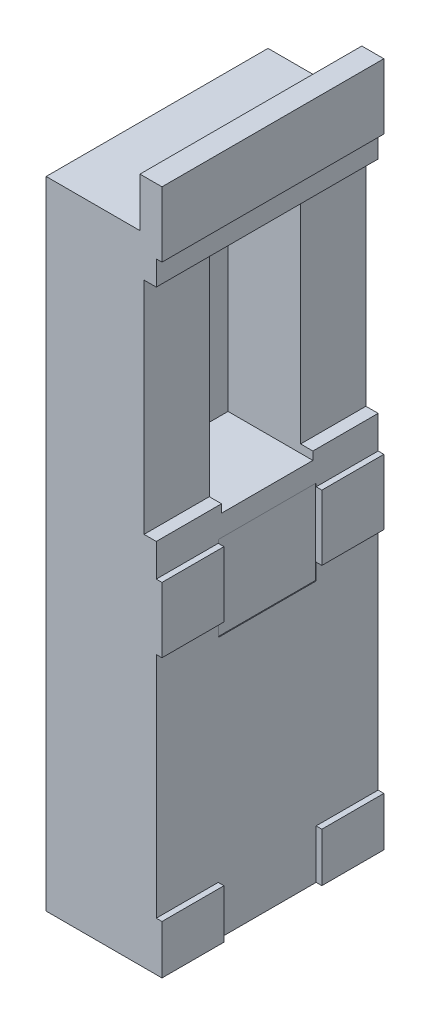
ISO-10303-21;
HEADER;
FILE_DESCRIPTION(('STEP AP214'),'2;1');
FILE_NAME('part.step','',(''),(''),'','','');
FILE_SCHEMA(('AUTOMOTIVE_DESIGN { 1 0 10303 214 1 1 1 1 }'));
ENDSEC;
DATA;
#1=APPLICATION_CONTEXT('core data for automotive mechanical design processes');
#2=APPLICATION_PROTOCOL_DEFINITION('international standard','automotive_design',2000,#1);
#3=PRODUCT_CONTEXT('',#1,'mechanical');
#4=PRODUCT('Part','Part','',(#3));
#5=PRODUCT_RELATED_PRODUCT_CATEGORY('part','',(#4));
#6=PRODUCT_DEFINITION_FORMATION('','',#4);
#7=PRODUCT_DEFINITION_CONTEXT('part definition',#1,'design');
#8=PRODUCT_DEFINITION('design','',#6,#7);
#9=PRODUCT_DEFINITION_SHAPE('','',#8);
#10=(LENGTH_UNIT() NAMED_UNIT(*) SI_UNIT(.MILLI.,.METRE.));
#11=(NAMED_UNIT(*) PLANE_ANGLE_UNIT() SI_UNIT($,.RADIAN.));
#12=(NAMED_UNIT(*) SI_UNIT($,.STERADIAN.) SOLID_ANGLE_UNIT());
#13=UNCERTAINTY_MEASURE_WITH_UNIT(LENGTH_MEASURE(1.E-05),#10,'distance_accuracy_value','');
#14=(GEOMETRIC_REPRESENTATION_CONTEXT(3) GLOBAL_UNCERTAINTY_ASSIGNED_CONTEXT((#13)) GLOBAL_UNIT_ASSIGNED_CONTEXT((#10,
#11,#12)) REPRESENTATION_CONTEXT('',''));
#15=CARTESIAN_POINT('',(0.,0.,0.));
#16=DIRECTION('',(0.,0.,1.));
#17=DIRECTION('',(1.,0.,0.));
#18=AXIS2_PLACEMENT_3D('',#15,#16,#17);
#19=CARTESIAN_POINT('',(-10.2,32.,13.6));
#20=DIRECTION('',(-1.,0.,0.));
#21=DIRECTION('',(0.,0.,1.));
#22=AXIS2_PLACEMENT_3D('',#19,#20,#21);
#23=PLANE('',#22);
#24=DIRECTION('',(0.,-1.,0.));
#25=VECTOR('',#24,1.);
#26=CARTESIAN_POINT('',(-10.2,32.,9.8));
#27=LINE('',#26,#25);
#28=CARTESIAN_POINT('',(-10.2,18.,9.8));
#29=VERTEX_POINT('',#28);
#30=CARTESIAN_POINT('',(-10.2,15.,9.8));
#31=VERTEX_POINT('',#30);
#32=EDGE_CURVE('E46',#29,#31,#27,.T.);
#33=ORIENTED_EDGE('',*,*,#32,.T.);
#34=DIRECTION('',(0.,0.,-1.));
#35=VECTOR('',#34,1.);
#36=CARTESIAN_POINT('',(-10.2,15.,13.6));
#37=LINE('',#36,#35);
#38=CARTESIAN_POINT('',(-10.2,15.,3.8));
#39=VERTEX_POINT('',#38);
#40=EDGE_CURVE('E394',#31,#39,#37,.T.);
#41=ORIENTED_EDGE('',*,*,#40,.T.);
#42=DIRECTION('',(0.,-1.,0.));
#43=VECTOR('',#42,1.);
#44=CARTESIAN_POINT('',(-10.2,32.,3.8));
#45=LINE('',#44,#43);
#46=CARTESIAN_POINT('',(-10.2,18.,3.8));
#47=VERTEX_POINT('',#46);
#48=EDGE_CURVE('E387',#47,#39,#45,.T.);
#49=ORIENTED_EDGE('',*,*,#48,.F.);
#50=DIRECTION('',(0.,0.,1.));
#51=VECTOR('',#50,1.);
#52=CARTESIAN_POINT('',(-10.2,18.,13.6));
#53=LINE('',#52,#51);
#54=CARTESIAN_POINT('',(-10.2,18.,0.));
#55=VERTEX_POINT('',#54);
#56=EDGE_CURVE('E424',#55,#47,#53,.T.);
#57=ORIENTED_EDGE('',*,*,#56,.F.);
#58=DIRECTION('',(0.,1.,0.));
#59=VECTOR('',#58,1.);
#60=CARTESIAN_POINT('',(-10.2,32.,0.));
#61=LINE('',#60,#59);
#62=CARTESIAN_POINT('',(-10.2,32.,0.));
#63=VERTEX_POINT('',#62);
#64=EDGE_CURVE('E307',#55,#63,#61,.T.);
#65=ORIENTED_EDGE('',*,*,#64,.T.);
#66=DIRECTION('',(0.,0.,-1.));
#67=VECTOR('',#66,1.);
#68=CARTESIAN_POINT('',(-10.2,32.,13.6));
#69=LINE('',#68,#67);
#70=CARTESIAN_POINT('',(-10.2,32.,3.8));
#71=VERTEX_POINT('',#70);
#72=EDGE_CURVE('E369',#71,#63,#69,.T.);
#73=ORIENTED_EDGE('',*,*,#72,.F.);
#74=DIRECTION('',(0.,-1.,0.));
#75=VECTOR('',#74,1.);
#76=CARTESIAN_POINT('',(-10.2,32.,3.8));
#77=LINE('',#76,#75);
#78=CARTESIAN_POINT('',(-10.2,31.,3.8));
#79=VERTEX_POINT('',#78);
#80=EDGE_CURVE('E463',#71,#79,#77,.T.);
#81=ORIENTED_EDGE('',*,*,#80,.T.);
#82=DIRECTION('',(0.,0.,1.));
#83=VECTOR('',#82,1.);
#84=CARTESIAN_POINT('',(-10.2,31.,13.6));
#85=LINE('',#84,#83);
#86=CARTESIAN_POINT('',(-10.2,31.,9.8));
#87=VERTEX_POINT('',#86);
#88=EDGE_CURVE('E384',#79,#87,#85,.T.);
#89=ORIENTED_EDGE('',*,*,#88,.T.);
#90=DIRECTION('',(0.,-1.,0.));
#91=VECTOR('',#90,1.);
#92=CARTESIAN_POINT('',(-10.2,32.,9.8));
#93=LINE('',#92,#91);
#94=CARTESIAN_POINT('',(-10.2,32.,9.8));
#95=VERTEX_POINT('',#94);
#96=EDGE_CURVE('E456',#95,#87,#93,.T.);
#97=ORIENTED_EDGE('',*,*,#96,.F.);
#98=CARTESIAN_POINT('',(-10.2,32.,13.6));
#99=VERTEX_POINT('',#98);
#100=EDGE_CURVE('E370',#99,#95,#69,.T.);
#101=ORIENTED_EDGE('',*,*,#100,.F.);
#102=DIRECTION('',(0.,1.,0.));
#103=VECTOR('',#102,1.);
#104=CARTESIAN_POINT('',(-10.2,32.,13.6));
#105=LINE('',#104,#103);
#106=CARTESIAN_POINT('',(-10.2,18.,13.6));
#107=VERTEX_POINT('',#106);
#108=EDGE_CURVE('E341',#107,#99,#105,.T.);
#109=ORIENTED_EDGE('',*,*,#108,.F.);
#110=DIRECTION('',(0.,0.,1.));
#111=VECTOR('',#110,1.);
#112=CARTESIAN_POINT('',(-10.2,18.,13.6));
#113=LINE('',#112,#111);
#114=EDGE_CURVE('E397',#29,#107,#113,.T.);
#115=ORIENTED_EDGE('',*,*,#114,.F.);
#116=EDGE_LOOP('',(#33,#41,#49,#57,#65,#73,#81,#89,#97,#101,#109,#115));
#117=FACE_BOUND('',#116,.T.);
#118=ADVANCED_FACE('F39',(#117),#23,.F.);
#119=CARTESIAN_POINT('',(-4.7,32.,13.6));
#120=DIRECTION('',(0.,1.,0.));
#121=DIRECTION('',(0.,0.,1.));
#122=AXIS2_PLACEMENT_3D('',#119,#120,#121);
#123=PLANE('',#122);
#124=DIRECTION('',(-1.,0.,0.));
#125=VECTOR('',#124,1.);
#126=CARTESIAN_POINT('',(-4.7,32.,9.8));
#127=LINE('',#126,#125);
#128=CARTESIAN_POINT('',(-9.85,32.,9.8));
#129=VERTEX_POINT('',#128);
#130=EDGE_CURVE('E454',#129,#95,#127,.T.);
#131=ORIENTED_EDGE('',*,*,#130,.F.);
#132=DIRECTION('',(0.,0.,1.));
#133=VECTOR('',#132,1.);
#134=CARTESIAN_POINT('',(-9.85,32.,13.6));
#135=LINE('',#134,#133);
#136=CARTESIAN_POINT('',(-9.85,32.,13.6));
#137=VERTEX_POINT('',#136);
#138=EDGE_CURVE('E590',#129,#137,#135,.T.);
#139=ORIENTED_EDGE('',*,*,#138,.T.);
#140=DIRECTION('',(1.,0.,0.));
#141=VECTOR('',#140,1.);
#142=CARTESIAN_POINT('',(-4.7,32.,13.6));
#143=LINE('',#142,#141);
#144=EDGE_CURVE('E502',#99,#137,#143,.T.);
#145=ORIENTED_EDGE('',*,*,#144,.F.);
#146=ORIENTED_EDGE('',*,*,#100,.T.);
#147=EDGE_LOOP('',(#131,#139,#145,#146));
#148=FACE_BOUND('',#147,.T.);
#149=ADVANCED_FACE('F588',(#148),#123,.F.);
#150=CARTESIAN_POINT('',(-10.2,36.,13.6));
#151=DIRECTION('',(0.,-1.,0.));
#152=DIRECTION('',(0.,0.,-1.));
#153=AXIS2_PLACEMENT_3D('',#150,#151,#152);
#154=PLANE('',#153);
#155=DIRECTION('',(-1.,0.,0.));
#156=VECTOR('',#155,1.);
#157=CARTESIAN_POINT('',(-10.2,36.,13.6));
#158=LINE('',#157,#156);
#159=CARTESIAN_POINT('',(-9.85,36.,13.6));
#160=VERTEX_POINT('',#159);
#161=CARTESIAN_POINT('',(-10.2,36.,13.6));
#162=VERTEX_POINT('',#161);
#163=EDGE_CURVE('E505',#160,#162,#158,.T.);
#164=ORIENTED_EDGE('',*,*,#163,.F.);
#165=DIRECTION('',(0.,0.,-1.));
#166=VECTOR('',#165,1.);
#167=CARTESIAN_POINT('',(-9.85,36.,13.6));
#168=LINE('',#167,#166);
#169=CARTESIAN_POINT('',(-9.85,36.,9.8));
#170=VERTEX_POINT('',#169);
#171=EDGE_CURVE('E603',#160,#170,#168,.T.);
#172=ORIENTED_EDGE('',*,*,#171,.T.);
#173=DIRECTION('',(1.,0.,0.));
#174=VECTOR('',#173,1.);
#175=CARTESIAN_POINT('',(-10.2,36.,9.8));
#176=LINE('',#175,#174);
#177=CARTESIAN_POINT('',(-10.2,36.,9.8));
#178=VERTEX_POINT('',#177);
#179=EDGE_CURVE('E449',#178,#170,#176,.T.);
#180=ORIENTED_EDGE('',*,*,#179,.F.);
#181=DIRECTION('',(0.,0.,-1.));
#182=VECTOR('',#181,1.);
#183=CARTESIAN_POINT('',(-10.2,36.,13.6));
#184=LINE('',#183,#182);
#185=EDGE_CURVE('E366',#162,#178,#184,.T.);
#186=ORIENTED_EDGE('',*,*,#185,.F.);
#187=EDGE_LOOP('',(#164,#172,#180,#186));
#188=FACE_BOUND('',#187,.T.);
#189=ADVANCED_FACE('F644',(#188),#154,.F.);
#190=CARTESIAN_POINT('',(-10.95,38.,13.6));
#191=DIRECTION('',(0.,-1.,0.));
#192=DIRECTION('',(0.,0.,-1.));
#193=AXIS2_PLACEMENT_3D('',#190,#191,#192);
#194=PLANE('',#193);
#195=DIRECTION('',(1.,0.,0.));
#196=VECTOR('',#195,1.);
#197=CARTESIAN_POINT('',(-10.95,38.,9.6));
#198=LINE('',#197,#196);
#199=CARTESIAN_POINT('',(-10.95,38.,9.6));
#200=VERTEX_POINT('',#199);
#201=CARTESIAN_POINT('',(-10.2,38.,9.6));
#202=VERTEX_POINT('',#201);
#203=EDGE_CURVE('E489',#200,#202,#198,.T.);
#204=ORIENTED_EDGE('',*,*,#203,.F.);
#205=DIRECTION('',(0.,0.,-1.));
#206=VECTOR('',#205,1.);
#207=CARTESIAN_POINT('',(-10.95,38.,13.6));
#208=LINE('',#207,#206);
#209=CARTESIAN_POINT('',(-10.95,38.,13.6));
#210=VERTEX_POINT('',#209);
#211=EDGE_CURVE('E358',#210,#200,#208,.T.);
#212=ORIENTED_EDGE('',*,*,#211,.F.);
#213=DIRECTION('',(-1.,0.,0.));
#214=VECTOR('',#213,1.);
#215=CARTESIAN_POINT('',(-10.95,38.,13.6));
#216=LINE('',#215,#214);
#217=CARTESIAN_POINT('',(-10.2,38.,13.6));
#218=VERTEX_POINT('',#217);
#219=EDGE_CURVE('E509',#218,#210,#216,.T.);
#220=ORIENTED_EDGE('',*,*,#219,.F.);
#221=DIRECTION('',(0.,0.,-1.));
#222=VECTOR('',#221,1.);
#223=CARTESIAN_POINT('',(-10.2,38.,13.6));
#224=LINE('',#223,#222);
#225=EDGE_CURVE('E362',#218,#202,#224,.T.);
#226=ORIENTED_EDGE('',*,*,#225,.T.);
#227=EDGE_LOOP('',(#204,#212,#220,#226));
#228=FACE_BOUND('',#227,.T.);
#229=ADVANCED_FACE('F648',(#228),#194,.F.);
#230=CARTESIAN_POINT('',(-10.95,51.5,13.6));
#231=DIRECTION('',(-1.,0.,0.));
#232=DIRECTION('',(0.,0.,1.));
#233=AXIS2_PLACEMENT_3D('',#230,#231,#232);
#234=PLANE('',#233);
#235=DIRECTION('',(0.,-1.,0.));
#236=VECTOR('',#235,1.);
#237=CARTESIAN_POINT('',(-10.95,51.5,9.6));
#238=LINE('',#237,#236);
#239=CARTESIAN_POINT('',(-10.95,51.5,9.6));
#240=VERTEX_POINT('',#239);
#241=EDGE_CURVE('E485',#240,#200,#238,.T.);
#242=ORIENTED_EDGE('',*,*,#241,.F.);
#243=DIRECTION('',(0.,0.,-1.));
#244=VECTOR('',#243,1.);
#245=CARTESIAN_POINT('',(-10.95,51.5,13.6));
#246=LINE('',#245,#244);
#247=CARTESIAN_POINT('',(-10.95,51.5,13.6));
#248=VERTEX_POINT('',#247);
#249=EDGE_CURVE('E354',#248,#240,#246,.T.);
#250=ORIENTED_EDGE('',*,*,#249,.F.);
#251=DIRECTION('',(0.,1.,0.));
#252=VECTOR('',#251,1.);
#253=CARTESIAN_POINT('',(-10.95,51.5,13.6));
#254=LINE('',#253,#252);
#255=EDGE_CURVE('E511',#210,#248,#254,.T.);
#256=ORIENTED_EDGE('',*,*,#255,.F.);
#257=ORIENTED_EDGE('',*,*,#211,.T.);
#258=EDGE_LOOP('',(#242,#250,#256,#257));
#259=FACE_BOUND('',#258,.T.);
#260=ADVANCED_FACE('F652',(#259),#234,.F.);
#261=DIRECTION('',(1.,0.,0.));
#262=VECTOR('',#261,1.);
#263=CARTESIAN_POINT('',(-4.7,32.,0.));
#264=LINE('',#263,#262);
#265=CARTESIAN_POINT('',(-9.85,32.,0.));
#266=VERTEX_POINT('',#265);
#267=EDGE_CURVE('E309',#63,#266,#264,.T.);
#268=ORIENTED_EDGE('',*,*,#267,.T.);
#269=DIRECTION('',(0.,0.,1.));
#270=VECTOR('',#269,1.);
#271=CARTESIAN_POINT('',(-9.85,32.,13.6));
#272=LINE('',#271,#270);
#273=CARTESIAN_POINT('',(-9.85,32.,3.8));
#274=VERTEX_POINT('',#273);
#275=EDGE_CURVE('E571',#266,#274,#272,.T.);
#276=ORIENTED_EDGE('',*,*,#275,.T.);
#277=DIRECTION('',(-1.,0.,0.));
#278=VECTOR('',#277,1.);
#279=CARTESIAN_POINT('',(-4.7,32.,3.8));
#280=LINE('',#279,#278);
#281=EDGE_CURVE('E461',#274,#71,#280,.T.);
#282=ORIENTED_EDGE('',*,*,#281,.T.);
#283=ORIENTED_EDGE('',*,*,#72,.T.);
#284=EDGE_LOOP('',(#268,#276,#282,#283));
#285=FACE_BOUND('',#284,.T.);
#286=ADVANCED_FACE('F567',(#285),#123,.F.);
#287=DIRECTION('',(1.,0.,0.));
#288=VECTOR('',#287,1.);
#289=CARTESIAN_POINT('',(-10.2,36.,3.8));
#290=LINE('',#289,#288);
#291=CARTESIAN_POINT('',(-10.2,36.,3.8));
#292=VERTEX_POINT('',#291);
#293=CARTESIAN_POINT('',(-9.85,36.,3.8));
#294=VERTEX_POINT('',#293);
#295=EDGE_CURVE('E458',#292,#294,#290,.T.);
#296=ORIENTED_EDGE('',*,*,#295,.T.);
#297=DIRECTION('',(0.,0.,-1.));
#298=VECTOR('',#297,1.);
#299=CARTESIAN_POINT('',(-9.85,36.,13.6));
#300=LINE('',#299,#298);
#301=CARTESIAN_POINT('',(-9.85,36.,0.));
#302=VERTEX_POINT('',#301);
#303=EDGE_CURVE('E61',#294,#302,#300,.T.);
#304=ORIENTED_EDGE('',*,*,#303,.T.);
#305=DIRECTION('',(-1.,0.,0.));
#306=VECTOR('',#305,1.);
#307=CARTESIAN_POINT('',(-10.2,36.,0.));
#308=LINE('',#307,#306);
#309=CARTESIAN_POINT('',(-10.2,36.,0.));
#310=VERTEX_POINT('',#309);
#311=EDGE_CURVE('E313',#302,#310,#308,.T.);
#312=ORIENTED_EDGE('',*,*,#311,.T.);
#313=EDGE_CURVE('E365',#292,#310,#184,.T.);
#314=ORIENTED_EDGE('',*,*,#313,.F.);
#315=EDGE_LOOP('',(#296,#304,#312,#314));
#316=FACE_BOUND('',#315,.T.);
#317=ADVANCED_FACE('F612',(#316),#154,.F.);
#318=CARTESIAN_POINT('',(-10.2,38.,13.6));
#319=DIRECTION('',(-1.,0.,0.));
#320=DIRECTION('',(0.,0.,1.));
#321=AXIS2_PLACEMENT_3D('',#318,#319,#320);
#322=PLANE('',#321);
#323=DIRECTION('',(0.,0.,-1.));
#324=VECTOR('',#323,1.);
#325=CARTESIAN_POINT('',(-10.2,36.2,13.6));
#326=LINE('',#325,#324);
#327=CARTESIAN_POINT('',(-10.2,36.2,9.8));
#328=VERTEX_POINT('',#327);
#329=CARTESIAN_POINT('',(-10.2,36.2,3.8));
#330=VERTEX_POINT('',#329);
#331=EDGE_CURVE('E378',#328,#330,#326,.T.);
#332=ORIENTED_EDGE('',*,*,#331,.T.);
#333=DIRECTION('',(0.,-1.,0.));
#334=VECTOR('',#333,1.);
#335=CARTESIAN_POINT('',(-10.2,38.,3.8));
#336=LINE('',#335,#334);
#337=EDGE_CURVE('E381',#330,#292,#336,.T.);
#338=ORIENTED_EDGE('',*,*,#337,.T.);
#339=ORIENTED_EDGE('',*,*,#313,.T.);
#340=DIRECTION('',(0.,1.,0.));
#341=VECTOR('',#340,1.);
#342=CARTESIAN_POINT('',(-10.2,38.,0.));
#343=LINE('',#342,#341);
#344=CARTESIAN_POINT('',(-10.2,38.,0.));
#345=VERTEX_POINT('',#344);
#346=EDGE_CURVE('E315',#310,#345,#343,.T.);
#347=ORIENTED_EDGE('',*,*,#346,.T.);
#348=CARTESIAN_POINT('',(-10.2,38.,4.));
#349=VERTEX_POINT('',#348);
#350=EDGE_CURVE('E361',#349,#345,#224,.T.);
#351=ORIENTED_EDGE('',*,*,#350,.F.);
#352=DIRECTION('',(0.,-1.,0.));
#353=VECTOR('',#352,1.);
#354=CARTESIAN_POINT('',(-10.2,38.,4.));
#355=LINE('',#354,#353);
#356=CARTESIAN_POINT('',(-10.2,37.5,4.));
#357=VERTEX_POINT('',#356);
#358=EDGE_CURVE('E310',#349,#357,#355,.T.);
#359=ORIENTED_EDGE('',*,*,#358,.T.);
#360=DIRECTION('',(0.,0.,1.));
#361=VECTOR('',#360,1.);
#362=CARTESIAN_POINT('',(-10.2,37.5,13.6));
#363=LINE('',#362,#361);
#364=CARTESIAN_POINT('',(-10.2,37.5,9.6));
#365=VERTEX_POINT('',#364);
#366=EDGE_CURVE('E373',#357,#365,#363,.T.);
#367=ORIENTED_EDGE('',*,*,#366,.T.);
#368=DIRECTION('',(0.,-1.,0.));
#369=VECTOR('',#368,1.);
#370=CARTESIAN_POINT('',(-10.2,38.,9.6));
#371=LINE('',#370,#369);
#372=EDGE_CURVE('E491',#202,#365,#371,.T.);
#373=ORIENTED_EDGE('',*,*,#372,.F.);
#374=ORIENTED_EDGE('',*,*,#225,.F.);
#375=DIRECTION('',(0.,1.,0.));
#376=VECTOR('',#375,1.);
#377=CARTESIAN_POINT('',(-10.2,38.,13.6));
#378=LINE('',#377,#376);
#379=EDGE_CURVE('E507',#162,#218,#378,.T.);
#380=ORIENTED_EDGE('',*,*,#379,.F.);
#381=ORIENTED_EDGE('',*,*,#185,.T.);
#382=DIRECTION('',(0.,-1.,0.));
#383=VECTOR('',#382,1.);
#384=CARTESIAN_POINT('',(-10.2,38.,9.8));
#385=LINE('',#384,#383);
#386=EDGE_CURVE('E376',#328,#178,#385,.T.);
#387=ORIENTED_EDGE('',*,*,#386,.F.);
#388=EDGE_LOOP('',(#332,#338,#339,#347,#351,#359,#367,#373,#374,#380,#381,#387));
#389=FACE_BOUND('',#388,.T.);
#390=ADVANCED_FACE('F620',(#389),#322,.F.);
#391=CARTESIAN_POINT('',(-10.95,38.,4.));
#392=VERTEX_POINT('',#391);
#393=CARTESIAN_POINT('',(-10.95,38.,0.));
#394=VERTEX_POINT('',#393);
#395=EDGE_CURVE('E357',#392,#394,#208,.T.);
#396=ORIENTED_EDGE('',*,*,#395,.F.);
#397=DIRECTION('',(1.,0.,0.));
#398=VECTOR('',#397,1.);
#399=CARTESIAN_POINT('',(-10.95,38.,4.));
#400=LINE('',#399,#398);
#401=EDGE_CURVE('E496',#392,#349,#400,.T.);
#402=ORIENTED_EDGE('',*,*,#401,.T.);
#403=ORIENTED_EDGE('',*,*,#350,.T.);
#404=DIRECTION('',(-1.,0.,0.));
#405=VECTOR('',#404,1.);
#406=CARTESIAN_POINT('',(-10.95,38.,0.));
#407=LINE('',#406,#405);
#408=EDGE_CURVE('E318',#345,#394,#407,.T.);
#409=ORIENTED_EDGE('',*,*,#408,.T.);
#410=EDGE_LOOP('',(#396,#402,#403,#409));
#411=FACE_BOUND('',#410,.T.);
#412=ADVANCED_FACE('F665',(#411),#194,.F.);
#413=CARTESIAN_POINT('',(-10.95,51.5,4.));
#414=VERTEX_POINT('',#413);
#415=CARTESIAN_POINT('',(-10.95,51.5,0.));
#416=VERTEX_POINT('',#415);
#417=EDGE_CURVE('E353',#414,#416,#246,.T.);
#418=ORIENTED_EDGE('',*,*,#417,.F.);
#419=DIRECTION('',(0.,-1.,0.));
#420=VECTOR('',#419,1.);
#421=CARTESIAN_POINT('',(-10.95,51.5,4.));
#422=LINE('',#421,#420);
#423=EDGE_CURVE('E493',#414,#392,#422,.T.);
#424=ORIENTED_EDGE('',*,*,#423,.T.);
#425=ORIENTED_EDGE('',*,*,#395,.T.);
#426=DIRECTION('',(0.,1.,0.));
#427=VECTOR('',#426,1.);
#428=CARTESIAN_POINT('',(-10.95,51.5,0.));
#429=LINE('',#428,#427);
#430=EDGE_CURVE('E321',#394,#416,#429,.T.);
#431=ORIENTED_EDGE('',*,*,#430,.T.);
#432=EDGE_LOOP('',(#418,#424,#425,#431));
#433=FACE_BOUND('',#432,.T.);
#434=ADVANCED_FACE('F659',(#433),#234,.F.);
#435=CARTESIAN_POINT('',(-10.2,51.5,13.6));
#436=DIRECTION('',(0.,1.,0.));
#437=DIRECTION('',(0.,0.,1.));
#438=AXIS2_PLACEMENT_3D('',#435,#436,#437);
#439=PLANE('',#438);
#440=DIRECTION('',(1.,0.,0.));
#441=VECTOR('',#440,1.);
#442=CARTESIAN_POINT('',(-10.2,51.5,0.));
#443=LINE('',#442,#441);
#444=CARTESIAN_POINT('',(-10.2,51.5,0.));
#445=VERTEX_POINT('',#444);
#446=EDGE_CURVE('E324',#416,#445,#443,.T.);
#447=ORIENTED_EDGE('',*,*,#446,.T.);
#448=DIRECTION('',(0.,0.,-1.));
#449=VECTOR('',#448,1.);
#450=CARTESIAN_POINT('',(-10.2,51.5,13.6));
#451=LINE('',#450,#449);
#452=CARTESIAN_POINT('',(-10.2,51.5,13.6));
#453=VERTEX_POINT('',#452);
#454=EDGE_CURVE('E351',#453,#445,#451,.T.);
#455=ORIENTED_EDGE('',*,*,#454,.F.);
#456=DIRECTION('',(1.,0.,0.));
#457=VECTOR('',#456,1.);
#458=CARTESIAN_POINT('',(-10.2,51.5,13.6));
#459=LINE('',#458,#457);
#460=EDGE_CURVE('E513',#248,#453,#459,.T.);
#461=ORIENTED_EDGE('',*,*,#460,.F.);
#462=ORIENTED_EDGE('',*,*,#249,.T.);
#463=DIRECTION('',(-1.,0.,0.));
#464=VECTOR('',#463,1.);
#465=CARTESIAN_POINT('',(-15.4,51.5,9.6));
#466=LINE('',#465,#464);
#467=CARTESIAN_POINT('',(-15.4,51.5,9.6));
#468=VERTEX_POINT('',#467);
#469=EDGE_CURVE('E466',#240,#468,#466,.T.);
#470=ORIENTED_EDGE('',*,*,#469,.T.);
#471=DIRECTION('',(0.,0.,1.));
#472=VECTOR('',#471,1.);
#473=CARTESIAN_POINT('',(-15.4,51.5,4.));
#474=LINE('',#473,#472);
#475=CARTESIAN_POINT('',(-15.4,51.5,4.));
#476=VERTEX_POINT('',#475);
#477=EDGE_CURVE('E476',#476,#468,#474,.T.);
#478=ORIENTED_EDGE('',*,*,#477,.F.);
#479=DIRECTION('',(-1.,0.,0.));
#480=VECTOR('',#479,1.);
#481=CARTESIAN_POINT('',(-15.4,51.5,4.));
#482=LINE('',#481,#480);
#483=EDGE_CURVE('E467',#414,#476,#482,.T.);
#484=ORIENTED_EDGE('',*,*,#483,.F.);
#485=ORIENTED_EDGE('',*,*,#417,.T.);
#486=EDGE_LOOP('',(#447,#455,#461,#462,#470,#478,#484,#485));
#487=FACE_BOUND('',#486,.T.);
#488=ADVANCED_FACE('F669',(#487),#439,.F.);
#489=CARTESIAN_POINT('',(-10.2,53.,13.6));
#490=DIRECTION('',(-1.,0.,0.));
#491=DIRECTION('',(0.,0.,1.));
#492=AXIS2_PLACEMENT_3D('',#489,#490,#491);
#493=PLANE('',#492);
#494=DIRECTION('',(0.,1.,0.));
#495=VECTOR('',#494,1.);
#496=CARTESIAN_POINT('',(-10.2,53.,0.));
#497=LINE('',#496,#495);
#498=CARTESIAN_POINT('',(-10.2,53.,0.));
#499=VERTEX_POINT('',#498);
#500=EDGE_CURVE('E327',#445,#499,#497,.T.);
#501=ORIENTED_EDGE('',*,*,#500,.T.);
#502=DIRECTION('',(0.,0.,-1.));
#503=VECTOR('',#502,1.);
#504=CARTESIAN_POINT('',(-10.2,53.,13.6));
#505=LINE('',#504,#503);
#506=CARTESIAN_POINT('',(-10.2,53.,13.6));
#507=VERTEX_POINT('',#506);
#508=EDGE_CURVE('E348',#507,#499,#505,.T.);
#509=ORIENTED_EDGE('',*,*,#508,.F.);
#510=DIRECTION('',(0.,1.,0.));
#511=VECTOR('',#510,1.);
#512=CARTESIAN_POINT('',(-10.2,53.,13.6));
#513=LINE('',#512,#511);
#514=EDGE_CURVE('E298',#453,#507,#513,.T.);
#515=ORIENTED_EDGE('',*,*,#514,.F.);
#516=ORIENTED_EDGE('',*,*,#454,.T.);
#517=EDGE_LOOP('',(#501,#509,#515,#516));
#518=FACE_BOUND('',#517,.T.);
#519=ADVANCED_FACE('F519',(#518),#493,.F.);
#520=CARTESIAN_POINT('',(-4.7,53.,13.6));
#521=DIRECTION('',(0.,1.,0.));
#522=DIRECTION('',(0.,0.,1.));
#523=AXIS2_PLACEMENT_3D('',#520,#521,#522);
#524=PLANE('',#523);
#525=DIRECTION('',(1.,0.,0.));
#526=VECTOR('',#525,1.);
#527=CARTESIAN_POINT('',(-4.7,53.,0.));
#528=LINE('',#527,#526);
#529=CARTESIAN_POINT('',(-9.85,53.,0.));
#530=VERTEX_POINT('',#529);
#531=EDGE_CURVE('E329',#499,#530,#528,.T.);
#532=ORIENTED_EDGE('',*,*,#531,.T.);
#533=DIRECTION('',(0.,0.,1.));
#534=VECTOR('',#533,1.);
#535=CARTESIAN_POINT('',(-9.85,53.,13.6));
#536=LINE('',#535,#534);
#537=CARTESIAN_POINT('',(-9.85,53.,13.6));
#538=VERTEX_POINT('',#537);
#539=EDGE_CURVE('E53',#530,#538,#536,.T.);
#540=ORIENTED_EDGE('',*,*,#539,.T.);
#541=DIRECTION('',(1.,0.,0.));
#542=VECTOR('',#541,1.);
#543=CARTESIAN_POINT('',(-4.7,53.,13.6));
#544=LINE('',#543,#542);
#545=EDGE_CURVE('E285',#507,#538,#544,.T.);
#546=ORIENTED_EDGE('',*,*,#545,.F.);
#547=ORIENTED_EDGE('',*,*,#508,.T.);
#548=EDGE_LOOP('',(#532,#540,#546,#547));
#549=FACE_BOUND('',#548,.T.);
#550=ADVANCED_FACE('F523',(#549),#524,.F.);
#551=CARTESIAN_POINT('',(-11.2,57.,13.6));
#552=DIRECTION('',(0.,-1.,0.));
#553=DIRECTION('',(0.,0.,-1.));
#554=AXIS2_PLACEMENT_3D('',#551,#552,#553);
#555=PLANE('',#554);
#556=DIRECTION('',(-1.,0.,0.));
#557=VECTOR('',#556,1.);
#558=CARTESIAN_POINT('',(-11.2,57.,13.6));
#559=LINE('',#558,#557);
#560=CARTESIAN_POINT('',(-9.85,57.,13.6));
#561=VERTEX_POINT('',#560);
#562=CARTESIAN_POINT('',(-11.2,57.,13.6));
#563=VERTEX_POINT('',#562);
#564=EDGE_CURVE('E282',#561,#563,#559,.T.);
#565=ORIENTED_EDGE('',*,*,#564,.F.);
#566=DIRECTION('',(0.,0.,-1.));
#567=VECTOR('',#566,1.);
#568=CARTESIAN_POINT('',(-9.85,57.,13.6));
#569=LINE('',#568,#567);
#570=CARTESIAN_POINT('',(-9.85,57.,0.));
#571=VERTEX_POINT('',#570);
#572=EDGE_CURVE('E269',#561,#571,#569,.T.);
#573=ORIENTED_EDGE('',*,*,#572,.T.);
#574=DIRECTION('',(-1.,0.,0.));
#575=VECTOR('',#574,1.);
#576=CARTESIAN_POINT('',(-11.2,57.,0.));
#577=LINE('',#576,#575);
#578=CARTESIAN_POINT('',(-11.2,57.,0.));
#579=VERTEX_POINT('',#578);
#580=EDGE_CURVE('E332',#571,#579,#577,.T.);
#581=ORIENTED_EDGE('',*,*,#580,.T.);
#582=DIRECTION('',(0.,0.,-1.));
#583=VECTOR('',#582,1.);
#584=CARTESIAN_POINT('',(-11.2,57.,13.6));
#585=LINE('',#584,#583);
#586=EDGE_CURVE('E292',#563,#579,#585,.T.);
#587=ORIENTED_EDGE('',*,*,#586,.F.);
#588=EDGE_LOOP('',(#565,#573,#581,#587));
#589=FACE_BOUND('',#588,.T.);
#590=ADVANCED_FACE('F290',(#589),#555,.F.);
#591=CARTESIAN_POINT('',(-11.2,54.,13.6));
#592=DIRECTION('',(1.,0.,0.));
#593=DIRECTION('',(0.,0.,-1.));
#594=AXIS2_PLACEMENT_3D('',#591,#592,#593);
#595=PLANE('',#594);
#596=DIRECTION('',(0.,-1.,0.));
#597=VECTOR('',#596,1.);
#598=CARTESIAN_POINT('',(-11.2,54.,0.));
#599=LINE('',#598,#597);
#600=CARTESIAN_POINT('',(-11.2,54.,0.));
#601=VERTEX_POINT('',#600);
#602=EDGE_CURVE('E334',#579,#601,#599,.T.);
#603=ORIENTED_EDGE('',*,*,#602,.T.);
#604=DIRECTION('',(0.,0.,-1.));
#605=VECTOR('',#604,1.);
#606=CARTESIAN_POINT('',(-11.2,54.,13.6));
#607=LINE('',#606,#605);
#608=CARTESIAN_POINT('',(-11.2,54.,13.6));
#609=VERTEX_POINT('',#608);
#610=EDGE_CURVE('E344',#609,#601,#607,.T.);
#611=ORIENTED_EDGE('',*,*,#610,.F.);
#612=DIRECTION('',(0.,-1.,0.));
#613=VECTOR('',#612,1.);
#614=CARTESIAN_POINT('',(-11.2,54.,13.6));
#615=LINE('',#614,#613);
#616=EDGE_CURVE('E294',#563,#609,#615,.T.);
#617=ORIENTED_EDGE('',*,*,#616,.F.);
#618=ORIENTED_EDGE('',*,*,#586,.T.);
#619=EDGE_LOOP('',(#603,#611,#617,#618));
#620=FACE_BOUND('',#619,.T.);
#621=ADVANCED_FACE('F687',(#620),#595,.F.);
#622=CARTESIAN_POINT('',(-16.95,54.,13.6));
#623=DIRECTION('',(0.,-1.,0.));
#624=DIRECTION('',(0.,0.,-1.));
#625=AXIS2_PLACEMENT_3D('',#622,#623,#624);
#626=PLANE('',#625);
#627=DIRECTION('',(-1.,0.,0.));
#628=VECTOR('',#627,1.);
#629=CARTESIAN_POINT('',(-16.95,54.,0.));
#630=LINE('',#629,#628);
#631=CARTESIAN_POINT('',(-16.95,54.,0.));
#632=VERTEX_POINT('',#631);
#633=EDGE_CURVE('E336',#601,#632,#630,.T.);
#634=ORIENTED_EDGE('',*,*,#633,.T.);
#635=DIRECTION('',(0.,0.,-1.));
#636=VECTOR('',#635,1.);
#637=CARTESIAN_POINT('',(-16.95,54.,13.6));
#638=LINE('',#637,#636);
#639=CARTESIAN_POINT('',(-16.95,54.,13.6));
#640=VERTEX_POINT('',#639);
#641=EDGE_CURVE('E306',#640,#632,#638,.T.);
#642=ORIENTED_EDGE('',*,*,#641,.F.);
#643=DIRECTION('',(-1.,0.,0.));
#644=VECTOR('',#643,1.);
#645=CARTESIAN_POINT('',(-16.95,54.,13.6));
#646=LINE('',#645,#644);
#647=EDGE_CURVE('E296',#609,#640,#646,.T.);
#648=ORIENTED_EDGE('',*,*,#647,.F.);
#649=ORIENTED_EDGE('',*,*,#610,.T.);
#650=EDGE_LOOP('',(#634,#642,#648,#649));
#651=FACE_BOUND('',#650,.T.);
#652=ADVANCED_FACE('F691',(#651),#626,.F.);
#653=CARTESIAN_POINT('',(-16.95,0.,13.6));
#654=DIRECTION('',(1.,0.,0.));
#655=DIRECTION('',(0.,0.,-1.));
#656=AXIS2_PLACEMENT_3D('',#653,#654,#655);
#657=PLANE('',#656);
#658=DIRECTION('',(0.,-1.,0.));
#659=VECTOR('',#658,1.);
#660=CARTESIAN_POINT('',(-16.95,0.,0.));
#661=LINE('',#660,#659);
#662=CARTESIAN_POINT('',(-16.95,15.,0.));
#663=VERTEX_POINT('',#662);
#664=EDGE_CURVE('E338',#632,#663,#661,.T.);
#665=ORIENTED_EDGE('',*,*,#664,.T.);
#666=DIRECTION('',(0.,0.,1.));
#667=VECTOR('',#666,1.);
#668=CARTESIAN_POINT('',(-16.95,15.,13.6));
#669=LINE('',#668,#667);
#670=CARTESIAN_POINT('',(-16.95,15.,13.6));
#671=VERTEX_POINT('',#670);
#672=EDGE_CURVE('E412',#663,#671,#669,.T.);
#673=ORIENTED_EDGE('',*,*,#672,.T.);
#674=DIRECTION('',(0.,-1.,0.));
#675=VECTOR('',#674,1.);
#676=CARTESIAN_POINT('',(-16.95,0.,13.6));
#677=LINE('',#676,#675);
#678=EDGE_CURVE('E303',#640,#671,#677,.T.);
#679=ORIENTED_EDGE('',*,*,#678,.F.);
#680=ORIENTED_EDGE('',*,*,#641,.T.);
#681=EDGE_LOOP('',(#665,#673,#679,#680));
#682=FACE_BOUND('',#681,.T.);
#683=ADVANCED_FACE('F536',(#682),#657,.F.);
#684=CARTESIAN_POINT('',(0.,0.,13.6));
#685=DIRECTION('',(0.,0.,-1.));
#686=DIRECTION('',(-1.,0.,0.));
#687=AXIS2_PLACEMENT_3D('',#684,#685,#686);
#688=PLANE('',#687);
#689=DIRECTION('',(1.,0.,0.));
#690=VECTOR('',#689,1.);
#691=CARTESIAN_POINT('',(-7.5,15.,13.6));
#692=LINE('',#691,#690);
#693=CARTESIAN_POINT('',(-9.85,15.,13.6));
#694=VERTEX_POINT('',#693);
#695=EDGE_CURVE('E410',#671,#694,#692,.T.);
#696=ORIENTED_EDGE('',*,*,#695,.T.);
#697=DIRECTION('',(0.,-1.,0.));
#698=VECTOR('',#697,1.);
#699=CARTESIAN_POINT('',(-9.85,13.,13.6));
#700=LINE('',#699,#698);
#701=CARTESIAN_POINT('',(-9.85,18.,13.6));
#702=VERTEX_POINT('',#701);
#703=EDGE_CURVE('E289',#702,#694,#700,.T.);
#704=ORIENTED_EDGE('',*,*,#703,.F.);
#705=DIRECTION('',(-1.,0.,0.));
#706=VECTOR('',#705,1.);
#707=CARTESIAN_POINT('',(-11.2,18.,13.6));
#708=LINE('',#707,#706);
#709=EDGE_CURVE('E408',#702,#107,#708,.T.);
#710=ORIENTED_EDGE('',*,*,#709,.T.);
#711=ORIENTED_EDGE('',*,*,#108,.T.);
#712=ORIENTED_EDGE('',*,*,#144,.T.);
#713=EDGE_CURVE('E287',#160,#137,#700,.T.);
#714=ORIENTED_EDGE('',*,*,#713,.F.);
#715=ORIENTED_EDGE('',*,*,#163,.T.);
#716=ORIENTED_EDGE('',*,*,#379,.T.);
#717=ORIENTED_EDGE('',*,*,#219,.T.);
#718=ORIENTED_EDGE('',*,*,#255,.T.);
#719=ORIENTED_EDGE('',*,*,#460,.T.);
#720=ORIENTED_EDGE('',*,*,#514,.T.);
#721=ORIENTED_EDGE('',*,*,#545,.T.);
#722=EDGE_CURVE('E272',#561,#538,#700,.T.);
#723=ORIENTED_EDGE('',*,*,#722,.F.);
#724=ORIENTED_EDGE('',*,*,#564,.T.);
#725=ORIENTED_EDGE('',*,*,#616,.T.);
#726=ORIENTED_EDGE('',*,*,#647,.T.);
#727=ORIENTED_EDGE('',*,*,#678,.T.);
#728=EDGE_LOOP('',(#696,#704,#710,#711,#712,#714,#715,#716,#717,#718,#719,#720,#721,#723,#724,
#725,#726,#727));
#729=FACE_BOUND('',#728,.T.);
#730=ADVANCED_FACE('F281',(#729),#688,.F.);
#731=CARTESIAN_POINT('',(0.,0.,0.));
#732=DIRECTION('',(0.,0.,-1.));
#733=DIRECTION('',(-1.,0.,0.));
#734=AXIS2_PLACEMENT_3D('',#731,#732,#733);
#735=PLANE('',#734);
#736=DIRECTION('',(0.,1.,0.));
#737=VECTOR('',#736,1.);
#738=CARTESIAN_POINT('',(-9.85,0.,0.));
#739=LINE('',#738,#737);
#740=CARTESIAN_POINT('',(-9.85,15.,0.));
#741=VERTEX_POINT('',#740);
#742=CARTESIAN_POINT('',(-9.85,18.,0.));
#743=VERTEX_POINT('',#742);
#744=EDGE_CURVE('E545',#741,#743,#739,.T.);
#745=ORIENTED_EDGE('',*,*,#744,.F.);
#746=DIRECTION('',(1.,0.,0.));
#747=VECTOR('',#746,1.);
#748=CARTESIAN_POINT('',(-7.5,15.,0.));
#749=LINE('',#748,#747);
#750=EDGE_CURVE('E421',#663,#741,#749,.T.);
#751=ORIENTED_EDGE('',*,*,#750,.F.);
#752=ORIENTED_EDGE('',*,*,#664,.F.);
#753=ORIENTED_EDGE('',*,*,#633,.F.);
#754=ORIENTED_EDGE('',*,*,#602,.F.);
#755=ORIENTED_EDGE('',*,*,#580,.F.);
#756=EDGE_CURVE('E273',#530,#571,#739,.T.);
#757=ORIENTED_EDGE('',*,*,#756,.F.);
#758=ORIENTED_EDGE('',*,*,#531,.F.);
#759=ORIENTED_EDGE('',*,*,#500,.F.);
#760=ORIENTED_EDGE('',*,*,#446,.F.);
#761=ORIENTED_EDGE('',*,*,#430,.F.);
#762=ORIENTED_EDGE('',*,*,#408,.F.);
#763=ORIENTED_EDGE('',*,*,#346,.F.);
#764=ORIENTED_EDGE('',*,*,#311,.F.);
#765=EDGE_CURVE('E600',#266,#302,#739,.T.);
#766=ORIENTED_EDGE('',*,*,#765,.F.);
#767=ORIENTED_EDGE('',*,*,#267,.F.);
#768=ORIENTED_EDGE('',*,*,#64,.F.);
#769=DIRECTION('',(-1.,0.,0.));
#770=VECTOR('',#769,1.);
#771=CARTESIAN_POINT('',(-11.2,18.,0.));
#772=LINE('',#771,#770);
#773=EDGE_CURVE('E417',#743,#55,#772,.T.);
#774=ORIENTED_EDGE('',*,*,#773,.F.);
#775=EDGE_LOOP('',(#745,#751,#752,#753,#754,#755,#757,#758,#759,#760,#761,#762,#763,#764,#766,
#767,#768,#774));
#776=FACE_BOUND('',#775,.T.);
#777=ADVANCED_FACE('F542',(#776),#735,.T.);
#778=CARTESIAN_POINT('',(-7.,37.5,4.));
#779=DIRECTION('',(0.,-1.,0.));
#780=DIRECTION('',(0.,0.,-1.));
#781=AXIS2_PLACEMENT_3D('',#778,#779,#780);
#782=PLANE('',#781);
#783=DIRECTION('',(1.,0.,0.));
#784=VECTOR('',#783,1.);
#785=CARTESIAN_POINT('',(-7.,37.5,4.));
#786=LINE('',#785,#784);
#787=CARTESIAN_POINT('',(-15.4,37.5,4.));
#788=VERTEX_POINT('',#787);
#789=EDGE_CURVE('E473',#788,#357,#786,.T.);
#790=ORIENTED_EDGE('',*,*,#789,.F.);
#791=DIRECTION('',(0.,0.,1.));
#792=VECTOR('',#791,1.);
#793=CARTESIAN_POINT('',(-15.4,37.5,4.));
#794=LINE('',#793,#792);
#795=CARTESIAN_POINT('',(-15.4,37.5,9.6));
#796=VERTEX_POINT('',#795);
#797=EDGE_CURVE('E483',#788,#796,#794,.T.);
#798=ORIENTED_EDGE('',*,*,#797,.T.);
#799=DIRECTION('',(1.,0.,0.));
#800=VECTOR('',#799,1.);
#801=CARTESIAN_POINT('',(-7.,37.5,9.6));
#802=LINE('',#801,#800);
#803=EDGE_CURVE('E470',#796,#365,#802,.T.);
#804=ORIENTED_EDGE('',*,*,#803,.T.);
#805=ORIENTED_EDGE('',*,*,#366,.F.);
#806=EDGE_LOOP('',(#790,#798,#804,#805));
#807=FACE_BOUND('',#806,.T.);
#808=ADVANCED_FACE('F774',(#807),#782,.F.);
#809=CARTESIAN_POINT('',(0.,0.,4.));
#810=DIRECTION('',(0.,0.,-1.));
#811=DIRECTION('',(-1.,0.,0.));
#812=AXIS2_PLACEMENT_3D('',#809,#810,#811);
#813=PLANE('',#812);
#814=ORIENTED_EDGE('',*,*,#401,.F.);
#815=ORIENTED_EDGE('',*,*,#423,.F.);
#816=ORIENTED_EDGE('',*,*,#483,.T.);
#817=DIRECTION('',(0.,-1.,0.));
#818=VECTOR('',#817,1.);
#819=CARTESIAN_POINT('',(-15.4,37.5,4.));
#820=LINE('',#819,#818);
#821=EDGE_CURVE('E469',#476,#788,#820,.T.);
#822=ORIENTED_EDGE('',*,*,#821,.T.);
#823=ORIENTED_EDGE('',*,*,#789,.T.);
#824=ORIENTED_EDGE('',*,*,#358,.F.);
#825=EDGE_LOOP('',(#814,#815,#816,#822,#823,#824));
#826=FACE_BOUND('',#825,.T.);
#827=ADVANCED_FACE('F684',(#826),#813,.F.);
#828=CARTESIAN_POINT('',(0.,0.,9.6));
#829=DIRECTION('',(0.,0.,-1.));
#830=DIRECTION('',(-1.,0.,0.));
#831=AXIS2_PLACEMENT_3D('',#828,#829,#830);
#832=PLANE('',#831);
#833=ORIENTED_EDGE('',*,*,#372,.T.);
#834=ORIENTED_EDGE('',*,*,#803,.F.);
#835=DIRECTION('',(0.,-1.,0.));
#836=VECTOR('',#835,1.);
#837=CARTESIAN_POINT('',(-15.4,37.5,9.6));
#838=LINE('',#837,#836);
#839=EDGE_CURVE('E478',#468,#796,#838,.T.);
#840=ORIENTED_EDGE('',*,*,#839,.F.);
#841=ORIENTED_EDGE('',*,*,#469,.F.);
#842=ORIENTED_EDGE('',*,*,#241,.T.);
#843=ORIENTED_EDGE('',*,*,#203,.T.);
#844=EDGE_LOOP('',(#833,#834,#840,#841,#842,#843));
#845=FACE_BOUND('',#844,.T.);
#846=ADVANCED_FACE('F789',(#845),#832,.T.);
#847=CARTESIAN_POINT('',(-15.4,37.5,4.));
#848=DIRECTION('',(-1.,0.,0.));
#849=DIRECTION('',(0.,0.,1.));
#850=AXIS2_PLACEMENT_3D('',#847,#848,#849);
#851=PLANE('',#850);
#852=ORIENTED_EDGE('',*,*,#839,.T.);
#853=ORIENTED_EDGE('',*,*,#797,.F.);
#854=ORIENTED_EDGE('',*,*,#821,.F.);
#855=ORIENTED_EDGE('',*,*,#477,.T.);
#856=EDGE_LOOP('',(#852,#853,#854,#855));
#857=FACE_BOUND('',#856,.T.);
#858=ADVANCED_FACE('F799',(#857),#851,.F.);
#859=CARTESIAN_POINT('',(-4.,31.,3.8));
#860=DIRECTION('',(0.,-1.,0.));
#861=DIRECTION('',(0.,0.,-1.));
#862=AXIS2_PLACEMENT_3D('',#859,#860,#861);
#863=PLANE('',#862);
#864=DIRECTION('',(1.,0.,0.));
#865=VECTOR('',#864,1.);
#866=CARTESIAN_POINT('',(-4.,31.,3.8));
#867=LINE('',#866,#865);
#868=CARTESIAN_POINT('',(-10.25,31.,3.8));
#869=VERTEX_POINT('',#868);
#870=EDGE_CURVE('E437',#869,#79,#867,.T.);
#871=ORIENTED_EDGE('',*,*,#870,.F.);
#872=DIRECTION('',(0.,0.,1.));
#873=VECTOR('',#872,1.);
#874=CARTESIAN_POINT('',(-10.25,31.,3.8));
#875=LINE('',#874,#873);
#876=CARTESIAN_POINT('',(-10.25,31.,9.8));
#877=VERTEX_POINT('',#876);
#878=EDGE_CURVE('E447',#869,#877,#875,.T.);
#879=ORIENTED_EDGE('',*,*,#878,.T.);
#880=DIRECTION('',(1.,0.,0.));
#881=VECTOR('',#880,1.);
#882=CARTESIAN_POINT('',(-4.,31.,9.8));
#883=LINE('',#882,#881);
#884=EDGE_CURVE('E434',#877,#87,#883,.T.);
#885=ORIENTED_EDGE('',*,*,#884,.T.);
#886=ORIENTED_EDGE('',*,*,#88,.F.);
#887=EDGE_LOOP('',(#871,#879,#885,#886));
#888=FACE_BOUND('',#887,.T.);
#889=ADVANCED_FACE('F578',(#888),#863,.F.);
#890=CARTESIAN_POINT('',(-10.25,36.2,3.8));
#891=DIRECTION('',(0.,1.,0.));
#892=DIRECTION('',(0.,0.,1.));
#893=AXIS2_PLACEMENT_3D('',#890,#891,#892);
#894=PLANE('',#893);
#895=DIRECTION('',(-1.,0.,0.));
#896=VECTOR('',#895,1.);
#897=CARTESIAN_POINT('',(-10.25,36.2,9.8));
#898=LINE('',#897,#896);
#899=CARTESIAN_POINT('',(-10.25,36.2,9.8));
#900=VERTEX_POINT('',#899);
#901=EDGE_CURVE('E430',#328,#900,#898,.T.);
#902=ORIENTED_EDGE('',*,*,#901,.T.);
#903=DIRECTION('',(0.,0.,1.));
#904=VECTOR('',#903,1.);
#905=CARTESIAN_POINT('',(-10.25,36.2,3.8));
#906=LINE('',#905,#904);
#907=CARTESIAN_POINT('',(-10.25,36.2,3.8));
#908=VERTEX_POINT('',#907);
#909=EDGE_CURVE('E440',#908,#900,#906,.T.);
#910=ORIENTED_EDGE('',*,*,#909,.F.);
#911=DIRECTION('',(-1.,0.,0.));
#912=VECTOR('',#911,1.);
#913=CARTESIAN_POINT('',(-10.25,36.2,3.8));
#914=LINE('',#913,#912);
#915=EDGE_CURVE('E431',#330,#908,#914,.T.);
#916=ORIENTED_EDGE('',*,*,#915,.F.);
#917=ORIENTED_EDGE('',*,*,#331,.F.);
#918=EDGE_LOOP('',(#902,#910,#916,#917));
#919=FACE_BOUND('',#918,.T.);
#920=ADVANCED_FACE('F626',(#919),#894,.F.);
#921=CARTESIAN_POINT('',(0.,0.,3.8));
#922=DIRECTION('',(0.,0.,-1.));
#923=DIRECTION('',(-1.,0.,0.));
#924=AXIS2_PLACEMENT_3D('',#921,#922,#923);
#925=PLANE('',#924);
#926=ORIENTED_EDGE('',*,*,#281,.F.);
#927=DIRECTION('',(0.,1.,0.));
#928=VECTOR('',#927,1.);
#929=CARTESIAN_POINT('',(-9.85,0.,3.8));
#930=LINE('',#929,#928);
#931=EDGE_CURVE('E607',#274,#294,#930,.T.);
#932=ORIENTED_EDGE('',*,*,#931,.T.);
#933=ORIENTED_EDGE('',*,*,#295,.F.);
#934=ORIENTED_EDGE('',*,*,#337,.F.);
#935=ORIENTED_EDGE('',*,*,#915,.T.);
#936=DIRECTION('',(0.,-1.,0.));
#937=VECTOR('',#936,1.);
#938=CARTESIAN_POINT('',(-10.25,31.,3.8));
#939=LINE('',#938,#937);
#940=EDGE_CURVE('E433',#908,#869,#939,.T.);
#941=ORIENTED_EDGE('',*,*,#940,.T.);
#942=ORIENTED_EDGE('',*,*,#870,.T.);
#943=ORIENTED_EDGE('',*,*,#80,.F.);
#944=EDGE_LOOP('',(#926,#932,#933,#934,#935,#941,#942,#943));
#945=FACE_BOUND('',#944,.T.);
#946=ADVANCED_FACE('F573',(#945),#925,.F.);
#947=CARTESIAN_POINT('',(0.,0.,9.8));
#948=DIRECTION('',(0.,0.,-1.));
#949=DIRECTION('',(-1.,0.,0.));
#950=AXIS2_PLACEMENT_3D('',#947,#948,#949);
#951=PLANE('',#950);
#952=DIRECTION('',(0.,1.,0.));
#953=VECTOR('',#952,1.);
#954=CARTESIAN_POINT('',(-9.85,0.,9.8));
#955=LINE('',#954,#953);
#956=EDGE_CURVE('E585',#129,#170,#955,.T.);
#957=ORIENTED_EDGE('',*,*,#956,.F.);
#958=ORIENTED_EDGE('',*,*,#130,.T.);
#959=ORIENTED_EDGE('',*,*,#96,.T.);
#960=ORIENTED_EDGE('',*,*,#884,.F.);
#961=DIRECTION('',(0.,-1.,0.));
#962=VECTOR('',#961,1.);
#963=CARTESIAN_POINT('',(-10.25,31.,9.8));
#964=LINE('',#963,#962);
#965=EDGE_CURVE('E442',#900,#877,#964,.T.);
#966=ORIENTED_EDGE('',*,*,#965,.F.);
#967=ORIENTED_EDGE('',*,*,#901,.F.);
#968=ORIENTED_EDGE('',*,*,#386,.T.);
#969=ORIENTED_EDGE('',*,*,#179,.T.);
#970=EDGE_LOOP('',(#957,#958,#959,#960,#966,#967,#968,#969));
#971=FACE_BOUND('',#970,.T.);
#972=ADVANCED_FACE('F583',(#971),#951,.T.);
#973=CARTESIAN_POINT('',(-10.25,31.,3.8));
#974=DIRECTION('',(-1.,0.,0.));
#975=DIRECTION('',(0.,0.,1.));
#976=AXIS2_PLACEMENT_3D('',#973,#974,#975);
#977=PLANE('',#976);
#978=ORIENTED_EDGE('',*,*,#965,.T.);
#979=ORIENTED_EDGE('',*,*,#878,.F.);
#980=ORIENTED_EDGE('',*,*,#940,.F.);
#981=ORIENTED_EDGE('',*,*,#909,.T.);
#982=EDGE_LOOP('',(#978,#979,#980,#981));
#983=FACE_BOUND('',#982,.T.);
#984=ADVANCED_FACE('F629',(#983),#977,.F.);
#985=CARTESIAN_POINT('',(0.,0.,3.8));
#986=DIRECTION('',(0.,0.,-1.));
#987=DIRECTION('',(-1.,0.,0.));
#988=AXIS2_PLACEMENT_3D('',#985,#986,#987);
#989=PLANE('',#988);
#990=DIRECTION('',(1.,0.,0.));
#991=VECTOR('',#990,1.);
#992=CARTESIAN_POINT('',(-7.5,15.,3.8));
#993=LINE('',#992,#991);
#994=CARTESIAN_POINT('',(-9.85,15.,3.8));
#995=VERTEX_POINT('',#994);
#996=EDGE_CURVE('E420',#39,#995,#993,.T.);
#997=ORIENTED_EDGE('',*,*,#996,.T.);
#998=DIRECTION('',(0.,1.,0.));
#999=VECTOR('',#998,1.);
#1000=CARTESIAN_POINT('',(-9.85,0.,3.8));
#1001=LINE('',#1000,#999);
#1002=CARTESIAN_POINT('',(-9.85,18.,3.8));
#1003=VERTEX_POINT('',#1002);
#1004=EDGE_CURVE('E550',#995,#1003,#1001,.T.);
#1005=ORIENTED_EDGE('',*,*,#1004,.T.);
#1006=DIRECTION('',(-1.,0.,0.));
#1007=VECTOR('',#1006,1.);
#1008=CARTESIAN_POINT('',(-11.2,18.,3.8));
#1009=LINE('',#1008,#1007);
#1010=EDGE_CURVE('E418',#1003,#47,#1009,.T.);
#1011=ORIENTED_EDGE('',*,*,#1010,.T.);
#1012=ORIENTED_EDGE('',*,*,#48,.T.);
#1013=EDGE_LOOP('',(#997,#1005,#1011,#1012));
#1014=FACE_BOUND('',#1013,.T.);
#1015=ADVANCED_FACE('F554',(#1014),#989,.F.);
#1016=CARTESIAN_POINT('',(-11.2,18.,3.8));
#1017=DIRECTION('',(0.,-1.,0.));
#1018=DIRECTION('',(0.,0.,-1.));
#1019=AXIS2_PLACEMENT_3D('',#1016,#1017,#1018);
#1020=PLANE('',#1019);
#1021=ORIENTED_EDGE('',*,*,#1010,.F.);
#1022=DIRECTION('',(0.,0.,-1.));
#1023=VECTOR('',#1022,1.);
#1024=CARTESIAN_POINT('',(-9.85,18.,3.8));
#1025=LINE('',#1024,#1023);
#1026=EDGE_CURVE('E561',#1003,#743,#1025,.T.);
#1027=ORIENTED_EDGE('',*,*,#1026,.T.);
#1028=ORIENTED_EDGE('',*,*,#773,.T.);
#1029=ORIENTED_EDGE('',*,*,#56,.T.);
#1030=EDGE_LOOP('',(#1021,#1027,#1028,#1029));
#1031=FACE_BOUND('',#1030,.T.);
#1032=ADVANCED_FACE('F558',(#1031),#1020,.F.);
#1033=CARTESIAN_POINT('',(-7.5,15.,3.8));
#1034=DIRECTION('',(0.,1.,0.));
#1035=DIRECTION('',(0.,0.,1.));
#1036=AXIS2_PLACEMENT_3D('',#1033,#1034,#1035);
#1037=PLANE('',#1036);
#1038=ORIENTED_EDGE('',*,*,#750,.T.);
#1039=DIRECTION('',(0.,0.,1.));
#1040=VECTOR('',#1039,1.);
#1041=CARTESIAN_POINT('',(-9.85,15.,3.8));
#1042=LINE('',#1041,#1040);
#1043=EDGE_CURVE('E548',#741,#995,#1042,.T.);
#1044=ORIENTED_EDGE('',*,*,#1043,.T.);
#1045=ORIENTED_EDGE('',*,*,#996,.F.);
#1046=ORIENTED_EDGE('',*,*,#40,.F.);
#1047=DIRECTION('',(1.,0.,0.));
#1048=VECTOR('',#1047,1.);
#1049=CARTESIAN_POINT('',(-7.5,15.,9.8));
#1050=LINE('',#1049,#1048);
#1051=CARTESIAN_POINT('',(-9.85,15.,9.8));
#1052=VERTEX_POINT('',#1051);
#1053=EDGE_CURVE('E405',#31,#1052,#1050,.T.);
#1054=ORIENTED_EDGE('',*,*,#1053,.T.);
#1055=EDGE_CURVE('E534',#1052,#694,#1042,.T.);
#1056=ORIENTED_EDGE('',*,*,#1055,.T.);
#1057=ORIENTED_EDGE('',*,*,#695,.F.);
#1058=ORIENTED_EDGE('',*,*,#672,.F.);
#1059=EDGE_LOOP('',(#1038,#1044,#1045,#1046,#1054,#1056,#1057,#1058));
#1060=FACE_BOUND('',#1059,.T.);
#1061=ADVANCED_FACE('F533',(#1060),#1037,.F.);
#1062=CARTESIAN_POINT('',(0.,0.,9.8));
#1063=DIRECTION('',(0.,0.,-1.));
#1064=DIRECTION('',(-1.,0.,0.));
#1065=AXIS2_PLACEMENT_3D('',#1062,#1063,#1064);
#1066=PLANE('',#1065);
#1067=DIRECTION('',(0.,1.,0.));
#1068=VECTOR('',#1067,1.);
#1069=CARTESIAN_POINT('',(-9.85,0.,9.8));
#1070=LINE('',#1069,#1068);
#1071=CARTESIAN_POINT('',(-9.85,18.,9.8));
#1072=VERTEX_POINT('',#1071);
#1073=EDGE_CURVE('E286',#1052,#1072,#1070,.T.);
#1074=ORIENTED_EDGE('',*,*,#1073,.F.);
#1075=ORIENTED_EDGE('',*,*,#1053,.F.);
#1076=ORIENTED_EDGE('',*,*,#32,.F.);
#1077=DIRECTION('',(-1.,0.,0.));
#1078=VECTOR('',#1077,1.);
#1079=CARTESIAN_POINT('',(-11.2,18.,9.8));
#1080=LINE('',#1079,#1078);
#1081=EDGE_CURVE('E403',#1072,#29,#1080,.T.);
#1082=ORIENTED_EDGE('',*,*,#1081,.F.);
#1083=EDGE_LOOP('',(#1074,#1075,#1076,#1082));
#1084=FACE_BOUND('',#1083,.T.);
#1085=ADVANCED_FACE('F402',(#1084),#1066,.T.);
#1086=CARTESIAN_POINT('',(-11.2,18.,13.6));
#1087=DIRECTION('',(0.,-1.,0.));
#1088=DIRECTION('',(0.,0.,-1.));
#1089=AXIS2_PLACEMENT_3D('',#1086,#1087,#1088);
#1090=PLANE('',#1089);
#1091=ORIENTED_EDGE('',*,*,#709,.F.);
#1092=DIRECTION('',(0.,0.,-1.));
#1093=VECTOR('',#1092,1.);
#1094=CARTESIAN_POINT('',(-9.85,18.,13.6));
#1095=LINE('',#1094,#1093);
#1096=EDGE_CURVE('E11',#702,#1072,#1095,.T.);
#1097=ORIENTED_EDGE('',*,*,#1096,.T.);
#1098=ORIENTED_EDGE('',*,*,#1081,.T.);
#1099=ORIENTED_EDGE('',*,*,#114,.T.);
#1100=EDGE_LOOP('',(#1091,#1097,#1098,#1099));
#1101=FACE_BOUND('',#1100,.T.);
#1102=ADVANCED_FACE('F593',(#1101),#1090,.F.);
#1103=CARTESIAN_POINT('',(-9.85,13.,-1.2E-05));
#1104=DIRECTION('',(-1.,0.,0.));
#1105=DIRECTION('',(0.,0.,1.));
#1106=AXIS2_PLACEMENT_3D('',#1103,#1104,#1105);
#1107=PLANE('',#1106);
#1108=ORIENTED_EDGE('',*,*,#1073,.T.);
#1109=ORIENTED_EDGE('',*,*,#1096,.F.);
#1110=ORIENTED_EDGE('',*,*,#703,.T.);
#1111=ORIENTED_EDGE('',*,*,#1055,.F.);
#1112=EDGE_LOOP('',(#1108,#1109,#1110,#1111));
#1113=FACE_BOUND('',#1112,.T.);
#1114=ADVANCED_FACE('F595',(#1113),#1107,.F.);
#1115=ORIENTED_EDGE('',*,*,#1004,.F.);
#1116=ORIENTED_EDGE('',*,*,#1043,.F.);
#1117=ORIENTED_EDGE('',*,*,#744,.T.);
#1118=ORIENTED_EDGE('',*,*,#1026,.F.);
#1119=EDGE_LOOP('',(#1115,#1116,#1117,#1118));
#1120=FACE_BOUND('',#1119,.T.);
#1121=ADVANCED_FACE('F942',(#1120),#1107,.F.);
#1122=ORIENTED_EDGE('',*,*,#956,.T.);
#1123=ORIENTED_EDGE('',*,*,#171,.F.);
#1124=ORIENTED_EDGE('',*,*,#713,.T.);
#1125=ORIENTED_EDGE('',*,*,#138,.F.);
#1126=EDGE_LOOP('',(#1122,#1123,#1124,#1125));
#1127=FACE_BOUND('',#1126,.T.);
#1128=ADVANCED_FACE('F951',(#1127),#1107,.F.);
#1129=ORIENTED_EDGE('',*,*,#765,.T.);
#1130=ORIENTED_EDGE('',*,*,#303,.F.);
#1131=ORIENTED_EDGE('',*,*,#931,.F.);
#1132=ORIENTED_EDGE('',*,*,#275,.F.);
#1133=EDGE_LOOP('',(#1129,#1130,#1131,#1132));
#1134=FACE_BOUND('',#1133,.T.);
#1135=ADVANCED_FACE('F609',(#1134),#1107,.F.);
#1136=ORIENTED_EDGE('',*,*,#756,.T.);
#1137=ORIENTED_EDGE('',*,*,#572,.F.);
#1138=ORIENTED_EDGE('',*,*,#722,.T.);
#1139=ORIENTED_EDGE('',*,*,#539,.F.);
#1140=EDGE_LOOP('',(#1136,#1137,#1138,#1139));
#1141=FACE_BOUND('',#1140,.T.);
#1142=ADVANCED_FACE('F271',(#1141),#1107,.F.);
#1143=CLOSED_SHELL('',(#118,#149,#189,#229,#260,#286,#317,#390,#412,#434,#488,#519,#550,#590,
#621,#652,#683,#730,#777,#808,#827,#846,#858,#889,#920,#946,#972,#984,#1015,#1032,#1061,#1085,
#1102,#1114,#1121,#1128,#1135,#1142));
#1144=MANIFOLD_SOLID_BREP('B2',#1143);
#1145=ADVANCED_BREP_SHAPE_REPRESENTATION('',(#18,#1144),#14);
#1146=SHAPE_DEFINITION_REPRESENTATION(#9,#1145);
ENDSEC;
END-ISO-10303-21;
